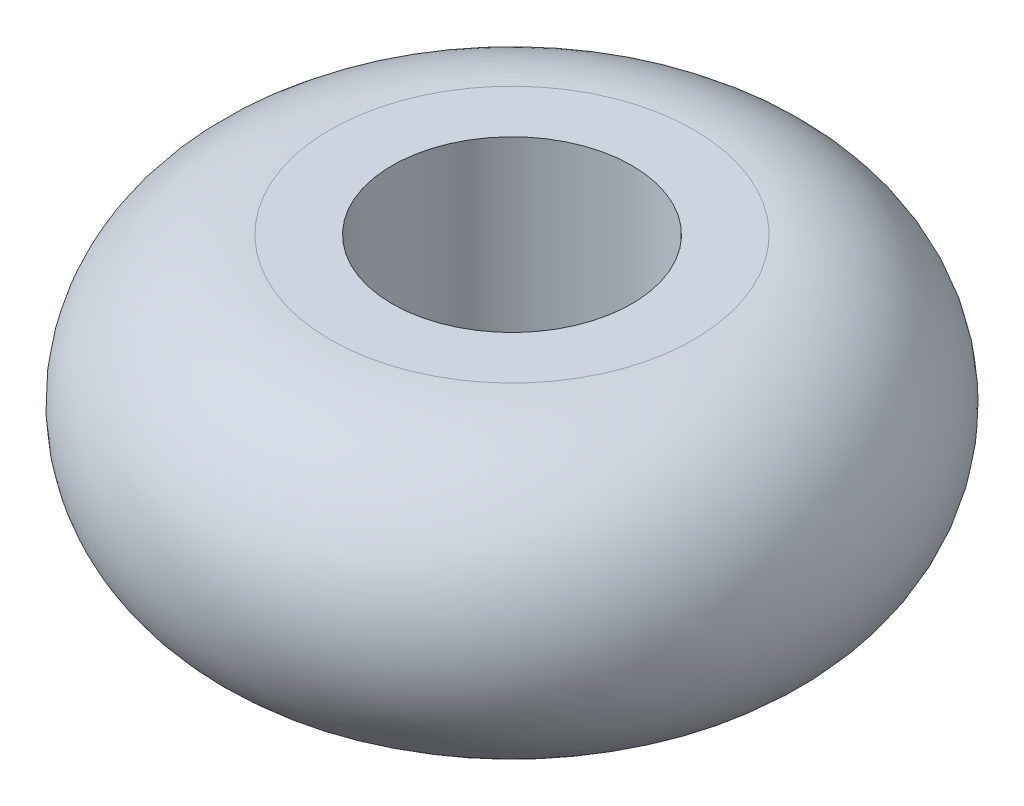
ISO-10303-21;
HEADER;
FILE_DESCRIPTION(('STEP AP214'),'2;1');
FILE_NAME('part.step','',(''),(''),'','','');
FILE_SCHEMA(('AUTOMOTIVE_DESIGN { 1 0 10303 214 1 1 1 1 }'));
ENDSEC;
DATA;
#1=APPLICATION_CONTEXT('core data for automotive mechanical design processes');
#2=APPLICATION_PROTOCOL_DEFINITION('international standard','automotive_design',2000,#1);
#3=PRODUCT_CONTEXT('',#1,'mechanical');
#4=PRODUCT('Part','Part','',(#3));
#5=PRODUCT_RELATED_PRODUCT_CATEGORY('part','',(#4));
#6=PRODUCT_DEFINITION_FORMATION('','',#4);
#7=PRODUCT_DEFINITION_CONTEXT('part definition',#1,'design');
#8=PRODUCT_DEFINITION('design','',#6,#7);
#9=PRODUCT_DEFINITION_SHAPE('','',#8);
#10=(LENGTH_UNIT() NAMED_UNIT(*) SI_UNIT(.MILLI.,.METRE.));
#11=(NAMED_UNIT(*) PLANE_ANGLE_UNIT() SI_UNIT($,.RADIAN.));
#12=(NAMED_UNIT(*) SI_UNIT($,.STERADIAN.) SOLID_ANGLE_UNIT());
#13=UNCERTAINTY_MEASURE_WITH_UNIT(LENGTH_MEASURE(1.E-05),#10,'distance_accuracy_value','');
#14=(GEOMETRIC_REPRESENTATION_CONTEXT(3) GLOBAL_UNCERTAINTY_ASSIGNED_CONTEXT((#13)) GLOBAL_UNIT_ASSIGNED_CONTEXT((#10,
#11,#12)) REPRESENTATION_CONTEXT('',''));
#15=CARTESIAN_POINT('',(0.,0.,0.));
#16=DIRECTION('',(0.,0.,1.));
#17=DIRECTION('',(1.,0.,0.));
#18=AXIS2_PLACEMENT_3D('',#15,#16,#17);
#19=CARTESIAN_POINT('',(0.,0.,0.));
#20=DIRECTION('',(0.,-1.,0.));
#21=DIRECTION('',(0.,0.,-1.));
#22=AXIS2_PLACEMENT_3D('',#19,#20,#21);
#23=CYLINDRICAL_SURFACE('',#22,30.);
#24=CARTESIAN_POINT('',(0.,0.,0.));
#25=DIRECTION('',(0.,-1.,0.));
#26=DIRECTION('',(0.,0.,-1.));
#27=AXIS2_PLACEMENT_3D('',#24,#25,#26);
#28=CIRCLE('',#27,30.);
#29=CARTESIAN_POINT('',(0.,0.,-30.));
#30=VERTEX_POINT('',#29);
#31=EDGE_CURVE('E50',#30,#30,#28,.F.);
#32=ORIENTED_EDGE('',*,*,#31,.F.);
#33=EDGE_LOOP('',(#32));
#34=FACE_BOUND('',#33,.T.);
#35=CARTESIAN_POINT('',(0.,73.,0.));
#36=DIRECTION('',(0.,-1.,0.));
#37=DIRECTION('',(0.,0.,-1.));
#38=AXIS2_PLACEMENT_3D('',#35,#36,#37);
#39=CIRCLE('',#38,30.);
#40=CARTESIAN_POINT('',(0.,73.,-30.));
#41=VERTEX_POINT('',#40);
#42=EDGE_CURVE('E127',#41,#41,#39,.T.);
#43=ORIENTED_EDGE('',*,*,#42,.F.);
#44=EDGE_LOOP('',(#43));
#45=FACE_BOUND('',#44,.T.);
#46=ADVANCED_FACE('F17',(#34,#45),#23,.F.);
#47=CARTESIAN_POINT('',(45.5,73.,0.));
#48=DIRECTION('',(0.,1.,0.));
#49=DIRECTION('',(0.,0.,1.));
#50=AXIS2_PLACEMENT_3D('',#47,#48,#49);
#51=PLANE('',#50);
#52=CARTESIAN_POINT('',(0.,73.,0.));
#53=DIRECTION('',(0.,-1.,0.));
#54=DIRECTION('',(0.,0.,-1.));
#55=AXIS2_PLACEMENT_3D('',#52,#53,#54);
#56=CIRCLE('',#55,45.5);
#57=CARTESIAN_POINT('',(0.,73.,-45.5));
#58=VERTEX_POINT('',#57);
#59=CARTESIAN_POINT('',(0.,73.,45.5));
#60=VERTEX_POINT('',#59);
#61=EDGE_CURVE('E28',#58,#60,#56,.T.);
#62=ORIENTED_EDGE('',*,*,#61,.F.);
#63=CARTESIAN_POINT('',(0.,73.,0.));
#64=DIRECTION('',(0.,-1.,0.));
#65=DIRECTION('',(0.,0.,1.));
#66=AXIS2_PLACEMENT_3D('',#63,#64,#65);
#67=CIRCLE('',#66,45.5);
#68=EDGE_CURVE('E45',#60,#58,#67,.T.);
#69=ORIENTED_EDGE('',*,*,#68,.F.);
#70=EDGE_LOOP('',(#62,#69));
#71=FACE_BOUND('',#70,.T.);
#72=ORIENTED_EDGE('',*,*,#42,.T.);
#73=EDGE_LOOP('',(#72));
#74=FACE_BOUND('',#73,.T.);
#75=ADVANCED_FACE('F47',(#71,#74),#51,.T.);
#76=CARTESIAN_POINT('',(30.,0.,0.));
#77=DIRECTION('',(0.,-1.,0.));
#78=DIRECTION('',(0.,0.,-1.));
#79=AXIS2_PLACEMENT_3D('',#76,#77,#78);
#80=PLANE('',#79);
#81=ORIENTED_EDGE('',*,*,#31,.T.);
#82=EDGE_LOOP('',(#81));
#83=FACE_BOUND('',#82,.T.);
#84=CARTESIAN_POINT('',(0.,0.,0.));
#85=DIRECTION('',(0.,1.,0.));
#86=DIRECTION('',(0.,0.,1.));
#87=AXIS2_PLACEMENT_3D('',#84,#85,#86);
#88=CIRCLE('',#87,45.4999999999999);
#89=CARTESIAN_POINT('',(0.,0.,45.5));
#90=VERTEX_POINT('',#89);
#91=CARTESIAN_POINT('',(0.,0.,-45.5));
#92=VERTEX_POINT('',#91);
#93=EDGE_CURVE('E11',#90,#92,#88,.T.);
#94=ORIENTED_EDGE('',*,*,#93,.F.);
#95=CARTESIAN_POINT('',(0.,0.,0.));
#96=DIRECTION('',(0.,1.,0.));
#97=DIRECTION('',(0.,0.,-1.));
#98=AXIS2_PLACEMENT_3D('',#95,#96,#97);
#99=CIRCLE('',#98,45.5);
#100=EDGE_CURVE('E35',#92,#90,#99,.T.);
#101=ORIENTED_EDGE('',*,*,#100,.F.);
#102=EDGE_LOOP('',(#94,#101));
#103=FACE_BOUND('',#102,.T.);
#104=ADVANCED_FACE('F71',(#83,#103),#80,.T.);
#105=CARTESIAN_POINT('',(0.,36.5,0.));
#106=DIRECTION('',(0.,-1.,0.));
#107=DIRECTION('',(0.,0.,-1.));
#108=AXIS2_PLACEMENT_3D('',#105,#106,#107);
#109=TOROIDAL_SURFACE('',#108,45.9959803404992,36.5033696595008);
#110=ORIENTED_EDGE('',*,*,#100,.T.);
#111=ORIENTED_EDGE('',*,*,#93,.T.);
#112=EDGE_LOOP('',(#110,#111));
#113=FACE_BOUND('',#112,.T.);
#114=ORIENTED_EDGE('',*,*,#61,.T.);
#115=ORIENTED_EDGE('',*,*,#68,.T.);
#116=EDGE_LOOP('',(#114,#115));
#117=FACE_BOUND('',#116,.T.);
#118=ADVANCED_FACE('F54',(#113,#117),#109,.T.);
#119=CLOSED_SHELL('',(#46,#75,#104,#118));
#120=MANIFOLD_SOLID_BREP('B1',#119);
#121=ADVANCED_BREP_SHAPE_REPRESENTATION('',(#18,#120),#14);
#122=SHAPE_DEFINITION_REPRESENTATION(#9,#121);
ENDSEC;
END-ISO-10303-21;
